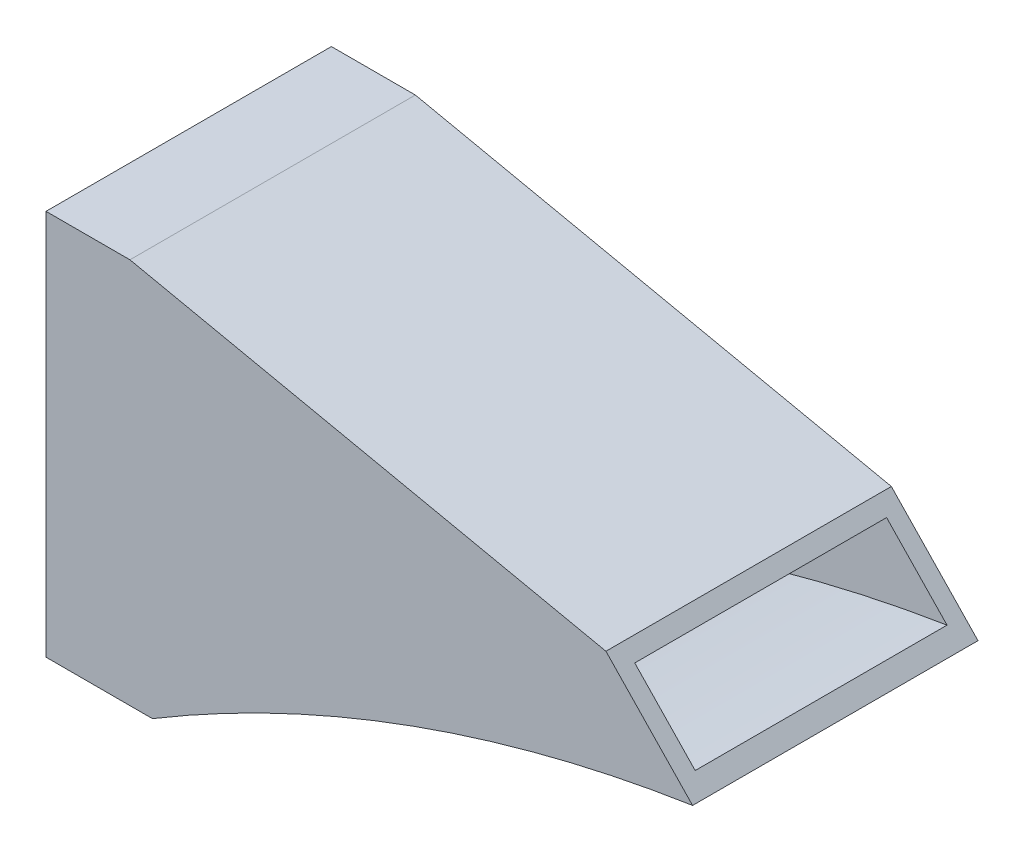
ISO-10303-21;
HEADER;
FILE_DESCRIPTION(('STEP AP214'),'2;1');
FILE_NAME('part.step','',(''),(''),'','','');
FILE_SCHEMA(('AUTOMOTIVE_DESIGN { 1 0 10303 214 1 1 1 1 }'));
ENDSEC;
DATA;
#1=APPLICATION_CONTEXT('core data for automotive mechanical design processes');
#2=APPLICATION_PROTOCOL_DEFINITION('international standard','automotive_design',2000,#1);
#3=PRODUCT_CONTEXT('',#1,'mechanical');
#4=PRODUCT('Part','Part','',(#3));
#5=PRODUCT_RELATED_PRODUCT_CATEGORY('part','',(#4));
#6=PRODUCT_DEFINITION_FORMATION('','',#4);
#7=PRODUCT_DEFINITION_CONTEXT('part definition',#1,'design');
#8=PRODUCT_DEFINITION('design','',#6,#7);
#9=PRODUCT_DEFINITION_SHAPE('','',#8);
#10=(LENGTH_UNIT() NAMED_UNIT(*) SI_UNIT(.MILLI.,.METRE.));
#11=(NAMED_UNIT(*) PLANE_ANGLE_UNIT() SI_UNIT($,.RADIAN.));
#12=(NAMED_UNIT(*) SI_UNIT($,.STERADIAN.) SOLID_ANGLE_UNIT());
#13=UNCERTAINTY_MEASURE_WITH_UNIT(LENGTH_MEASURE(1.E-05),#10,'distance_accuracy_value','');
#14=(GEOMETRIC_REPRESENTATION_CONTEXT(3) GLOBAL_UNCERTAINTY_ASSIGNED_CONTEXT((#13)) GLOBAL_UNIT_ASSIGNED_CONTEXT((#10,
#11,#12)) REPRESENTATION_CONTEXT('',''));
#15=CARTESIAN_POINT('',(0.,0.,0.));
#16=DIRECTION('',(0.,0.,1.));
#17=DIRECTION('',(1.,0.,0.));
#18=AXIS2_PLACEMENT_3D('',#15,#16,#17);
#19=CARTESIAN_POINT('',(22.4,5.69999999999999,-16.));
#20=DIRECTION('',(-1.,0.,0.));
#21=DIRECTION('',(0.,0.,1.));
#22=AXIS2_PLACEMENT_3D('',#19,#20,#21);
#23=PLANE('',#22);
#24=DIRECTION('',(0.,-1.,0.));
#25=VECTOR('',#24,1.);
#26=CARTESIAN_POINT('',(22.4,5.69999999999999,1.));
#27=LINE('',#26,#25);
#28=CARTESIAN_POINT('',(22.4,28.7,1.));
#29=VERTEX_POINT('',#28);
#30=CARTESIAN_POINT('',(22.4,5.69999999999999,1.));
#31=VERTEX_POINT('',#30);
#32=EDGE_CURVE('E164',#29,#31,#27,.T.);
#33=ORIENTED_EDGE('',*,*,#32,.F.);
#34=DIRECTION('',(0.,0.,1.));
#35=VECTOR('',#34,1.);
#36=CARTESIAN_POINT('',(22.4,28.7,-16.));
#37=LINE('',#36,#35);
#38=CARTESIAN_POINT('',(22.4,28.7,-16.));
#39=VERTEX_POINT('',#38);
#40=EDGE_CURVE('E42',#39,#29,#37,.T.);
#41=ORIENTED_EDGE('',*,*,#40,.F.);
#42=DIRECTION('',(0.,-1.,0.));
#43=VECTOR('',#42,1.);
#44=CARTESIAN_POINT('',(22.4,5.69999999999999,-16.));
#45=LINE('',#44,#43);
#46=CARTESIAN_POINT('',(22.4,5.69999999999999,-16.));
#47=VERTEX_POINT('',#46);
#48=EDGE_CURVE('E176',#39,#47,#45,.T.);
#49=ORIENTED_EDGE('',*,*,#48,.T.);
#50=DIRECTION('',(0.,0.,1.));
#51=VECTOR('',#50,1.);
#52=CARTESIAN_POINT('',(22.4,5.69999999999999,-16.));
#53=LINE('',#52,#51);
#54=EDGE_CURVE('E11',#47,#31,#53,.T.);
#55=ORIENTED_EDGE('',*,*,#54,.T.);
#56=EDGE_LOOP('',(#33,#41,#49,#55));
#57=FACE_BOUND('',#56,.T.);
#58=DIRECTION('',(0.,0.,1.));
#59=VECTOR('',#58,1.);
#60=CARTESIAN_POINT('',(22.4,6.69999999999999,-15.));
#61=LINE('',#60,#59);
#62=CARTESIAN_POINT('',(22.4,6.69999999999999,-15.));
#63=VERTEX_POINT('',#62);
#64=CARTESIAN_POINT('',(22.4,6.69999999999998,0.));
#65=VERTEX_POINT('',#64);
#66=EDGE_CURVE('E133',#63,#65,#61,.T.);
#67=ORIENTED_EDGE('',*,*,#66,.F.);
#68=DIRECTION('',(0.,-1.,0.));
#69=VECTOR('',#68,1.);
#70=CARTESIAN_POINT('',(22.4,6.69999999999999,-15.));
#71=LINE('',#70,#69);
#72=CARTESIAN_POINT('',(22.4,27.7,-15.));
#73=VERTEX_POINT('',#72);
#74=EDGE_CURVE('E140',#73,#63,#71,.T.);
#75=ORIENTED_EDGE('',*,*,#74,.F.);
#76=DIRECTION('',(0.,0.,1.));
#77=VECTOR('',#76,1.);
#78=CARTESIAN_POINT('',(22.4,27.7,-15.));
#79=LINE('',#78,#77);
#80=CARTESIAN_POINT('',(22.4,27.7,0.));
#81=VERTEX_POINT('',#80);
#82=EDGE_CURVE('E183',#73,#81,#79,.T.);
#83=ORIENTED_EDGE('',*,*,#82,.T.);
#84=DIRECTION('',(0.,-1.,0.));
#85=VECTOR('',#84,1.);
#86=CARTESIAN_POINT('',(22.4,6.69999999999999,0.));
#87=LINE('',#86,#85);
#88=EDGE_CURVE('E152',#81,#65,#87,.T.);
#89=ORIENTED_EDGE('',*,*,#88,.T.);
#90=EDGE_LOOP('',(#67,#75,#83,#89));
#91=FACE_BOUND('',#90,.T.);
#92=ADVANCED_FACE('F33',(#57,#91),#23,.T.);
#93=CARTESIAN_POINT('',(55.75301858689,22.6836363650302,-16.));
#94=DIRECTION('',(0.721218188324995,0.692707965039534,0.));
#95=DIRECTION('',(-0.692707965039534,0.721218188324995,0.));
#96=AXIS2_PLACEMENT_3D('',#93,#94,#95);
#97=PLANE('',#96);
#98=DIRECTION('',(-0.692707965039534,0.721218188324995,0.));
#99=VECTOR('',#98,1.);
#100=CARTESIAN_POINT('',(55.75301858689,22.6836363650302,1.));
#101=LINE('',#100,#99);
#102=CARTESIAN_POINT('',(60.9146289120443,17.3095863534428,1.));
#103=VERTEX_POINT('',#102);
#104=CARTESIAN_POINT('',(55.75301858689,22.6836363650302,1.));
#105=VERTEX_POINT('',#104);
#106=EDGE_CURVE('E186',#103,#105,#101,.T.);
#107=ORIENTED_EDGE('',*,*,#106,.F.);
#108=DIRECTION('',(0.,0.,1.));
#109=VECTOR('',#108,1.);
#110=CARTESIAN_POINT('',(60.9146289120443,17.3095863534428,-16.));
#111=LINE('',#110,#109);
#112=CARTESIAN_POINT('',(60.9146289120443,17.3095863534428,-16.));
#113=VERTEX_POINT('',#112);
#114=EDGE_CURVE('E201',#113,#103,#111,.T.);
#115=ORIENTED_EDGE('',*,*,#114,.F.);
#116=DIRECTION('',(-0.692707965039534,0.721218188324995,0.));
#117=VECTOR('',#116,1.);
#118=CARTESIAN_POINT('',(55.75301858689,22.6836363650302,-16.));
#119=LINE('',#118,#117);
#120=CARTESIAN_POINT('',(55.75301858689,22.6836363650302,-16.));
#121=VERTEX_POINT('',#120);
#122=EDGE_CURVE('E167',#113,#121,#119,.T.);
#123=ORIENTED_EDGE('',*,*,#122,.T.);
#124=DIRECTION('',(0.,0.,1.));
#125=VECTOR('',#124,1.);
#126=CARTESIAN_POINT('',(55.75301858689,22.6836363650302,-16.));
#127=LINE('',#126,#125);
#128=EDGE_CURVE('E200',#121,#105,#127,.T.);
#129=ORIENTED_EDGE('',*,*,#128,.T.);
#130=EDGE_LOOP('',(#107,#115,#123,#129));
#131=FACE_BOUND('',#130,.T.);
#132=DIRECTION('',(0.,0.,1.));
#133=VECTOR('',#132,1.);
#134=CARTESIAN_POINT('',(56.4692778834831,21.937897527986,-15.));
#135=LINE('',#134,#133);
#136=CARTESIAN_POINT('',(56.4692778834831,21.937897527986,-15.));
#137=VERTEX_POINT('',#136);
#138=CARTESIAN_POINT('',(56.4692778834831,21.937897527986,0.));
#139=VERTEX_POINT('',#138);
#140=EDGE_CURVE('E369',#137,#139,#135,.T.);
#141=ORIENTED_EDGE('',*,*,#140,.F.);
#142=DIRECTION('',(-0.692707965039534,0.721218188324995,0.));
#143=VECTOR('',#142,1.);
#144=CARTESIAN_POINT('',(60.0698840202112,18.1890989492736,-15.));
#145=LINE('',#144,#143);
#146=CARTESIAN_POINT('',(60.0698840202112,18.1890989492737,-15.));
#147=VERTEX_POINT('',#146);
#148=EDGE_CURVE('E376',#147,#137,#145,.T.);
#149=ORIENTED_EDGE('',*,*,#148,.F.);
#150=DIRECTION('',(0.,0.,1.));
#151=VECTOR('',#150,1.);
#152=CARTESIAN_POINT('',(60.0698840202112,18.1890989492737,-15.));
#153=LINE('',#152,#151);
#154=CARTESIAN_POINT('',(60.0698840202112,18.1890989492737,0.));
#155=VERTEX_POINT('',#154);
#156=EDGE_CURVE('E154',#147,#155,#153,.T.);
#157=ORIENTED_EDGE('',*,*,#156,.T.);
#158=DIRECTION('',(-0.692707965039534,0.721218188324995,0.));
#159=VECTOR('',#158,1.);
#160=CARTESIAN_POINT('',(60.0698840202112,18.1890989492736,0.));
#161=LINE('',#160,#159);
#162=EDGE_CURVE('E374',#155,#139,#161,.T.);
#163=ORIENTED_EDGE('',*,*,#162,.T.);
#164=EDGE_LOOP('',(#141,#149,#157,#163));
#165=FACE_BOUND('',#164,.T.);
#166=ADVANCED_FACE('F222',(#131,#165),#97,.T.);
#167=CARTESIAN_POINT('',(22.4,5.69999999999999,-16.));
#168=DIRECTION('',(0.,-1.,0.));
#169=DIRECTION('',(0.,0.,-1.));
#170=AXIS2_PLACEMENT_3D('',#167,#168,#169);
#171=PLANE('',#170);
#172=DIRECTION('',(1.,0.,0.));
#173=VECTOR('',#172,1.);
#174=CARTESIAN_POINT('',(22.4,5.69999999999999,1.));
#175=LINE('',#174,#173);
#176=CARTESIAN_POINT('',(28.7392780889093,5.69999999999997,1.));
#177=VERTEX_POINT('',#176);
#178=EDGE_CURVE('E179',#31,#177,#175,.T.);
#179=ORIENTED_EDGE('',*,*,#178,.F.);
#180=ORIENTED_EDGE('',*,*,#54,.F.);
#181=DIRECTION('',(1.,0.,0.));
#182=VECTOR('',#181,1.);
#183=CARTESIAN_POINT('',(22.4,5.69999999999999,-16.));
#184=LINE('',#183,#182);
#185=CARTESIAN_POINT('',(28.7392780889093,5.69999999999997,-16.));
#186=VERTEX_POINT('',#185);
#187=EDGE_CURVE('E160',#47,#186,#184,.T.);
#188=ORIENTED_EDGE('',*,*,#187,.T.);
#189=DIRECTION('',(0.,0.,1.));
#190=VECTOR('',#189,1.);
#191=CARTESIAN_POINT('',(28.7392780889093,5.69999999999997,-16.));
#192=LINE('',#191,#190);
#193=EDGE_CURVE('E37',#186,#177,#192,.T.);
#194=ORIENTED_EDGE('',*,*,#193,.T.);
#195=EDGE_LOOP('',(#179,#180,#188,#194));
#196=FACE_BOUND('',#195,.T.);
#197=ADVANCED_FACE('F35',(#196),#171,.T.);
#198=CARTESIAN_POINT('',(22.4,28.7,-16.));
#199=DIRECTION('',(0.,1.,0.));
#200=DIRECTION('',(0.,0.,1.));
#201=AXIS2_PLACEMENT_3D('',#198,#199,#200);
#202=PLANE('',#201);
#203=DIRECTION('',(-1.,0.,0.));
#204=VECTOR('',#203,1.);
#205=CARTESIAN_POINT('',(22.4,28.7,1.));
#206=LINE('',#205,#204);
#207=CARTESIAN_POINT('',(27.4,28.7,1.));
#208=VERTEX_POINT('',#207);
#209=EDGE_CURVE('E192',#208,#29,#206,.T.);
#210=ORIENTED_EDGE('',*,*,#209,.F.);
#211=DIRECTION('',(0.,0.,1.));
#212=VECTOR('',#211,1.);
#213=CARTESIAN_POINT('',(27.4,28.7,-16.));
#214=LINE('',#213,#212);
#215=CARTESIAN_POINT('',(27.4,28.7,-16.));
#216=VERTEX_POINT('',#215);
#217=EDGE_CURVE('E198',#216,#208,#214,.T.);
#218=ORIENTED_EDGE('',*,*,#217,.F.);
#219=DIRECTION('',(-1.,0.,0.));
#220=VECTOR('',#219,1.);
#221=CARTESIAN_POINT('',(22.4,28.7,-16.));
#222=LINE('',#221,#220);
#223=EDGE_CURVE('E173',#216,#39,#222,.T.);
#224=ORIENTED_EDGE('',*,*,#223,.T.);
#225=ORIENTED_EDGE('',*,*,#40,.T.);
#226=EDGE_LOOP('',(#210,#218,#224,#225));
#227=FACE_BOUND('',#226,.T.);
#228=ADVANCED_FACE('F228',(#227),#202,.T.);
#229=CARTESIAN_POINT('',(27.4,28.7,-16.));
#230=DIRECTION('',(0.207573110788497,0.97821950689893,0.));
#231=DIRECTION('',(-0.97821950689893,0.207573110788497,0.));
#232=AXIS2_PLACEMENT_3D('',#229,#230,#231);
#233=PLANE('',#232);
#234=DIRECTION('',(-0.97821950689893,0.207573110788497,0.));
#235=VECTOR('',#234,1.);
#236=CARTESIAN_POINT('',(27.4,28.7,1.));
#237=LINE('',#236,#235);
#238=EDGE_CURVE('E189',#105,#208,#237,.T.);
#239=ORIENTED_EDGE('',*,*,#238,.F.);
#240=ORIENTED_EDGE('',*,*,#128,.F.);
#241=DIRECTION('',(-0.97821950689893,0.207573110788497,0.));
#242=VECTOR('',#241,1.);
#243=CARTESIAN_POINT('',(27.4,28.7,-16.));
#244=LINE('',#243,#242);
#245=EDGE_CURVE('E170',#121,#216,#244,.T.);
#246=ORIENTED_EDGE('',*,*,#245,.T.);
#247=ORIENTED_EDGE('',*,*,#217,.T.);
#248=EDGE_LOOP('',(#239,#240,#246,#247));
#249=FACE_BOUND('',#248,.T.);
#250=ADVANCED_FACE('F226',(#249),#233,.T.);
#251=CARTESIAN_POINT('',(74.3215130464718,-70.2378091757568,-16.));
#252=DIRECTION('',(0.,0.,1.));
#253=DIRECTION('',(1.,0.,0.));
#254=AXIS2_PLACEMENT_3D('',#251,#252,#253);
#255=CYLINDRICAL_SURFACE('',#254,88.5680021573259);
#256=CARTESIAN_POINT('',(74.3215130464718,-70.2378091757568,1.));
#257=DIRECTION('',(0.,0.,-1.));
#258=DIRECTION('',(1.,0.,0.));
#259=AXIS2_PLACEMENT_3D('',#256,#257,#258);
#260=CIRCLE('',#259,88.5680021573259);
#261=EDGE_CURVE('E182',#177,#103,#260,.T.);
#262=ORIENTED_EDGE('',*,*,#261,.F.);
#263=ORIENTED_EDGE('',*,*,#193,.F.);
#264=CARTESIAN_POINT('',(74.3215130464718,-70.2378091757568,-16.));
#265=DIRECTION('',(0.,0.,-1.));
#266=DIRECTION('',(1.,0.,0.));
#267=AXIS2_PLACEMENT_3D('',#264,#265,#266);
#268=CIRCLE('',#267,88.5680021573259);
#269=EDGE_CURVE('E163',#186,#113,#268,.T.);
#270=ORIENTED_EDGE('',*,*,#269,.T.);
#271=ORIENTED_EDGE('',*,*,#114,.T.);
#272=EDGE_LOOP('',(#262,#263,#270,#271));
#273=FACE_BOUND('',#272,.T.);
#274=ADVANCED_FACE('F209',(#273),#255,.F.);
#275=CARTESIAN_POINT('',(74.3215130464718,-70.2378091757568,-16.));
#276=DIRECTION('',(0.,0.,1.));
#277=DIRECTION('',(1.,0.,0.));
#278=AXIS2_PLACEMENT_3D('',#275,#276,#277);
#279=PLANE('',#278);
#280=ORIENTED_EDGE('',*,*,#187,.F.);
#281=ORIENTED_EDGE('',*,*,#48,.F.);
#282=ORIENTED_EDGE('',*,*,#223,.F.);
#283=ORIENTED_EDGE('',*,*,#245,.F.);
#284=ORIENTED_EDGE('',*,*,#122,.F.);
#285=ORIENTED_EDGE('',*,*,#269,.F.);
#286=EDGE_LOOP('',(#280,#281,#282,#283,#284,#285));
#287=FACE_BOUND('',#286,.T.);
#288=ADVANCED_FACE('F217',(#287),#279,.F.);
#289=CARTESIAN_POINT('',(74.3215130464718,-70.2378091757568,1.));
#290=DIRECTION('',(0.,0.,1.));
#291=DIRECTION('',(1.,0.,0.));
#292=AXIS2_PLACEMENT_3D('',#289,#290,#291);
#293=PLANE('',#292);
#294=ORIENTED_EDGE('',*,*,#178,.T.);
#295=ORIENTED_EDGE('',*,*,#261,.T.);
#296=ORIENTED_EDGE('',*,*,#106,.T.);
#297=ORIENTED_EDGE('',*,*,#238,.T.);
#298=ORIENTED_EDGE('',*,*,#209,.T.);
#299=ORIENTED_EDGE('',*,*,#32,.T.);
#300=EDGE_LOOP('',(#294,#295,#296,#297,#298,#299));
#301=FACE_BOUND('',#300,.T.);
#302=ADVANCED_FACE('F211',(#301),#293,.T.);
#303=CARTESIAN_POINT('',(22.4,27.7,-15.));
#304=DIRECTION('',(0.,1.,0.));
#305=DIRECTION('',(0.,0.,1.));
#306=AXIS2_PLACEMENT_3D('',#303,#304,#305);
#307=PLANE('',#306);
#308=DIRECTION('',(-1.,0.,0.));
#309=VECTOR('',#308,1.);
#310=CARTESIAN_POINT('',(22.4,27.7,0.));
#311=LINE('',#310,#309);
#312=CARTESIAN_POINT('',(27.2950707390839,27.7,0.));
#313=VERTEX_POINT('',#312);
#314=EDGE_CURVE('E150',#313,#81,#311,.T.);
#315=ORIENTED_EDGE('',*,*,#314,.T.);
#316=ORIENTED_EDGE('',*,*,#82,.F.);
#317=DIRECTION('',(-1.,0.,0.));
#318=VECTOR('',#317,1.);
#319=CARTESIAN_POINT('',(22.4,27.7,-15.));
#320=LINE('',#319,#318);
#321=CARTESIAN_POINT('',(27.2950707390839,27.7,-15.));
#322=VERTEX_POINT('',#321);
#323=EDGE_CURVE('E147',#322,#73,#320,.T.);
#324=ORIENTED_EDGE('',*,*,#323,.F.);
#325=DIRECTION('',(0.,0.,1.));
#326=VECTOR('',#325,1.);
#327=CARTESIAN_POINT('',(27.2950707390839,27.7,-15.));
#328=LINE('',#327,#326);
#329=EDGE_CURVE('E359',#322,#313,#328,.T.);
#330=ORIENTED_EDGE('',*,*,#329,.T.);
#331=EDGE_LOOP('',(#315,#316,#324,#330));
#332=FACE_BOUND('',#331,.T.);
#333=ADVANCED_FACE('F245',(#332),#307,.F.);
#334=CARTESIAN_POINT('',(54.4498453506085,21.937897527986,-15.));
#335=DIRECTION('',(0.207573110788497,0.97821950689893,0.));
#336=DIRECTION('',(-0.97821950689893,0.207573110788497,0.));
#337=AXIS2_PLACEMENT_3D('',#334,#335,#336);
#338=PLANE('',#337);
#339=DIRECTION('',(-0.97821950689893,0.207573110788497,0.));
#340=VECTOR('',#339,1.);
#341=CARTESIAN_POINT('',(54.4498453506085,21.937897527986,0.));
#342=LINE('',#341,#340);
#343=CARTESIAN_POINT('',(54.4498453506085,21.937897527986,0.));
#344=VERTEX_POINT('',#343);
#345=EDGE_CURVE('E361',#344,#313,#342,.T.);
#346=ORIENTED_EDGE('',*,*,#345,.T.);
#347=ORIENTED_EDGE('',*,*,#329,.F.);
#348=DIRECTION('',(-0.97821950689893,0.207573110788497,0.));
#349=VECTOR('',#348,1.);
#350=CARTESIAN_POINT('',(54.4498453506085,21.937897527986,-15.));
#351=LINE('',#350,#349);
#352=CARTESIAN_POINT('',(54.4498453506085,21.937897527986,-15.));
#353=VERTEX_POINT('',#352);
#354=EDGE_CURVE('E156',#353,#322,#351,.T.);
#355=ORIENTED_EDGE('',*,*,#354,.F.);
#356=DIRECTION('',(0.,0.,1.));
#357=VECTOR('',#356,1.);
#358=CARTESIAN_POINT('',(54.4498453506085,21.937897527986,-15.));
#359=LINE('',#358,#357);
#360=EDGE_CURVE('E364',#353,#344,#359,.T.);
#361=ORIENTED_EDGE('',*,*,#360,.T.);
#362=EDGE_LOOP('',(#346,#347,#355,#361));
#363=FACE_BOUND('',#362,.T.);
#364=ADVANCED_FACE('F257',(#363),#338,.F.);
#365=CARTESIAN_POINT('',(56.4692778834831,21.937897527986,-15.));
#366=DIRECTION('',(0.,1.,0.));
#367=DIRECTION('',(0.,0.,1.));
#368=AXIS2_PLACEMENT_3D('',#365,#366,#367);
#369=PLANE('',#368);
#370=DIRECTION('',(-1.,0.,0.));
#371=VECTOR('',#370,1.);
#372=CARTESIAN_POINT('',(56.4692778834831,21.937897527986,0.));
#373=LINE('',#372,#371);
#374=EDGE_CURVE('E57',#139,#344,#373,.T.);
#375=ORIENTED_EDGE('',*,*,#374,.T.);
#376=ORIENTED_EDGE('',*,*,#360,.F.);
#377=DIRECTION('',(-1.,0.,0.));
#378=VECTOR('',#377,1.);
#379=CARTESIAN_POINT('',(56.4692778834831,21.937897527986,-15.));
#380=LINE('',#379,#378);
#381=EDGE_CURVE('E381',#137,#353,#380,.T.);
#382=ORIENTED_EDGE('',*,*,#381,.F.);
#383=ORIENTED_EDGE('',*,*,#140,.T.);
#384=EDGE_LOOP('',(#375,#376,#382,#383));
#385=FACE_BOUND('',#384,.T.);
#386=ADVANCED_FACE('F253',(#385),#369,.F.);
#387=CARTESIAN_POINT('',(74.3215130464718,-70.2378091757568,-15.));
#388=DIRECTION('',(0.,0.,1.));
#389=DIRECTION('',(1.,0.,0.));
#390=AXIS2_PLACEMENT_3D('',#387,#388,#389);
#391=CYLINDRICAL_SURFACE('',#390,89.5680021573259);
#392=CARTESIAN_POINT('',(74.3215130464718,-70.2378091757568,0.));
#393=DIRECTION('',(0.,0.,-1.));
#394=DIRECTION('',(1.,0.,0.));
#395=AXIS2_PLACEMENT_3D('',#392,#393,#394);
#396=CIRCLE('',#395,89.5680021573259);
#397=CARTESIAN_POINT('',(28.4630293200165,6.69999999999998,0.));
#398=VERTEX_POINT('',#397);
#399=EDGE_CURVE('E378',#398,#155,#396,.T.);
#400=ORIENTED_EDGE('',*,*,#399,.T.);
#401=ORIENTED_EDGE('',*,*,#156,.F.);
#402=CARTESIAN_POINT('',(74.3215130464718,-70.2378091757568,-15.));
#403=DIRECTION('',(0.,0.,-1.));
#404=DIRECTION('',(1.,0.,0.));
#405=AXIS2_PLACEMENT_3D('',#402,#403,#404);
#406=CIRCLE('',#405,89.5680021573259);
#407=CARTESIAN_POINT('',(28.4630293200165,6.69999999999998,-15.));
#408=VERTEX_POINT('',#407);
#409=EDGE_CURVE('E139',#408,#147,#406,.T.);
#410=ORIENTED_EDGE('',*,*,#409,.F.);
#411=DIRECTION('',(0.,0.,1.));
#412=VECTOR('',#411,1.);
#413=CARTESIAN_POINT('',(28.4630293200165,6.69999999999998,-15.));
#414=LINE('',#413,#412);
#415=EDGE_CURVE('E135',#408,#398,#414,.T.);
#416=ORIENTED_EDGE('',*,*,#415,.T.);
#417=EDGE_LOOP('',(#400,#401,#410,#416));
#418=FACE_BOUND('',#417,.T.);
#419=ADVANCED_FACE('F250',(#418),#391,.T.);
#420=CARTESIAN_POINT('',(22.4,6.69999999999999,-15.));
#421=DIRECTION('',(0.,-1.,0.));
#422=DIRECTION('',(1.,0.,0.));
#423=AXIS2_PLACEMENT_3D('',#420,#421,#422);
#424=PLANE('',#423);
#425=DIRECTION('',(1.,0.,0.));
#426=VECTOR('',#425,1.);
#427=CARTESIAN_POINT('',(22.4,6.69999999999999,0.));
#428=LINE('',#427,#426);
#429=EDGE_CURVE('E50',#65,#398,#428,.T.);
#430=ORIENTED_EDGE('',*,*,#429,.T.);
#431=ORIENTED_EDGE('',*,*,#415,.F.);
#432=DIRECTION('',(1.,0.,0.));
#433=VECTOR('',#432,1.);
#434=CARTESIAN_POINT('',(22.4,6.69999999999999,-15.));
#435=LINE('',#434,#433);
#436=EDGE_CURVE('E129',#63,#408,#435,.T.);
#437=ORIENTED_EDGE('',*,*,#436,.F.);
#438=ORIENTED_EDGE('',*,*,#66,.T.);
#439=EDGE_LOOP('',(#430,#431,#437,#438));
#440=FACE_BOUND('',#439,.T.);
#441=ADVANCED_FACE('F131',(#440),#424,.F.);
#442=CARTESIAN_POINT('',(74.3215130464718,-70.2378091757568,-15.));
#443=DIRECTION('',(0.,0.,1.));
#444=DIRECTION('',(1.,0.,0.));
#445=AXIS2_PLACEMENT_3D('',#442,#443,#444);
#446=PLANE('',#445);
#447=ORIENTED_EDGE('',*,*,#74,.T.);
#448=ORIENTED_EDGE('',*,*,#436,.T.);
#449=ORIENTED_EDGE('',*,*,#409,.T.);
#450=ORIENTED_EDGE('',*,*,#148,.T.);
#451=ORIENTED_EDGE('',*,*,#381,.T.);
#452=ORIENTED_EDGE('',*,*,#354,.T.);
#453=ORIENTED_EDGE('',*,*,#323,.T.);
#454=EDGE_LOOP('',(#447,#448,#449,#450,#451,#452,#453));
#455=FACE_BOUND('',#454,.T.);
#456=ADVANCED_FACE('F144',(#455),#446,.T.);
#457=CARTESIAN_POINT('',(74.3215130464718,-70.2378091757568,0.));
#458=DIRECTION('',(0.,0.,1.));
#459=DIRECTION('',(1.,0.,0.));
#460=AXIS2_PLACEMENT_3D('',#457,#458,#459);
#461=PLANE('',#460);
#462=ORIENTED_EDGE('',*,*,#88,.F.);
#463=ORIENTED_EDGE('',*,*,#314,.F.);
#464=ORIENTED_EDGE('',*,*,#345,.F.);
#465=ORIENTED_EDGE('',*,*,#374,.F.);
#466=ORIENTED_EDGE('',*,*,#162,.F.);
#467=ORIENTED_EDGE('',*,*,#399,.F.);
#468=ORIENTED_EDGE('',*,*,#429,.F.);
#469=EDGE_LOOP('',(#462,#463,#464,#465,#466,#467,#468));
#470=FACE_BOUND('',#469,.T.);
#471=ADVANCED_FACE('F265',(#470),#461,.F.);
#472=CLOSED_SHELL('',(#92,#166,#197,#228,#250,#274,#288,#302,#333,#364,#386,#419,#441,#456,#471));
#473=MANIFOLD_SOLID_BREP('B2',#472);
#474=ADVANCED_BREP_SHAPE_REPRESENTATION('',(#18,#473),#14);
#475=SHAPE_DEFINITION_REPRESENTATION(#9,#474);
ENDSEC;
END-ISO-10303-21;
